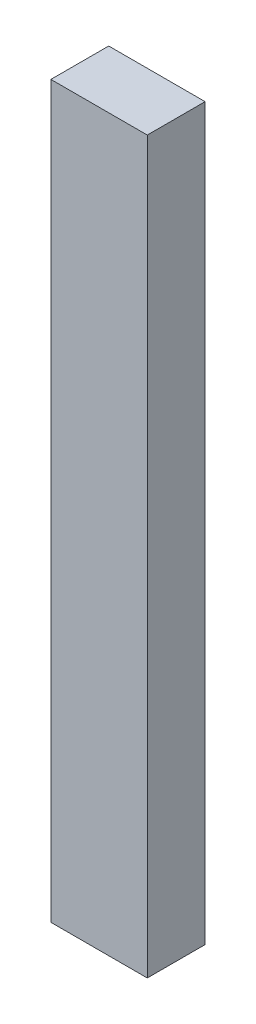
ISO-10303-21;
HEADER;
FILE_DESCRIPTION(('STEP AP214'),'2;1');
FILE_NAME('part.step','',(''),(''),'','','');
FILE_SCHEMA(('AUTOMOTIVE_DESIGN { 1 0 10303 214 1 1 1 1 }'));
ENDSEC;
DATA;
#1=APPLICATION_CONTEXT('core data for automotive mechanical design processes');
#2=APPLICATION_PROTOCOL_DEFINITION('international standard','automotive_design',2000,#1);
#3=PRODUCT_CONTEXT('',#1,'mechanical');
#4=PRODUCT('Part','Part','',(#3));
#5=PRODUCT_RELATED_PRODUCT_CATEGORY('part','',(#4));
#6=PRODUCT_DEFINITION_FORMATION('','',#4);
#7=PRODUCT_DEFINITION_CONTEXT('part definition',#1,'design');
#8=PRODUCT_DEFINITION('design','',#6,#7);
#9=PRODUCT_DEFINITION_SHAPE('','',#8);
#10=(LENGTH_UNIT() NAMED_UNIT(*) SI_UNIT(.MILLI.,.METRE.));
#11=(NAMED_UNIT(*) PLANE_ANGLE_UNIT() SI_UNIT($,.RADIAN.));
#12=(NAMED_UNIT(*) SI_UNIT($,.STERADIAN.) SOLID_ANGLE_UNIT());
#13=UNCERTAINTY_MEASURE_WITH_UNIT(LENGTH_MEASURE(1.E-05),#10,'distance_accuracy_value','');
#14=(GEOMETRIC_REPRESENTATION_CONTEXT(3) GLOBAL_UNCERTAINTY_ASSIGNED_CONTEXT((#13)) GLOBAL_UNIT_ASSIGNED_CONTEXT((#10,
#11,#12)) REPRESENTATION_CONTEXT('',''));
#15=CARTESIAN_POINT('',(0.,0.,0.));
#16=DIRECTION('',(0.,0.,1.));
#17=DIRECTION('',(1.,0.,0.));
#18=AXIS2_PLACEMENT_3D('',#15,#16,#17);
#19=CARTESIAN_POINT('',(0.,480.95,38.1));
#20=DIRECTION('',(1.,0.,0.));
#21=DIRECTION('',(0.,0.,-1.));
#22=AXIS2_PLACEMENT_3D('',#19,#20,#21);
#23=PLANE('',#22);
#24=DIRECTION('',(0.,-1.,0.));
#25=VECTOR('',#24,1.);
#26=CARTESIAN_POINT('',(0.,480.95,0.));
#27=LINE('',#26,#25);
#28=CARTESIAN_POINT('',(0.,480.95,0.));
#29=VERTEX_POINT('',#28);
#30=CARTESIAN_POINT('',(0.,0.,0.));
#31=VERTEX_POINT('',#30);
#32=EDGE_CURVE('E100',#29,#31,#27,.T.);
#33=ORIENTED_EDGE('',*,*,#32,.T.);
#34=DIRECTION('',(0.,0.,-1.));
#35=VECTOR('',#34,1.);
#36=CARTESIAN_POINT('',(0.,0.,38.1));
#37=LINE('',#36,#35);
#38=CARTESIAN_POINT('',(0.,0.,38.1));
#39=VERTEX_POINT('',#38);
#40=EDGE_CURVE('E11',#39,#31,#37,.T.);
#41=ORIENTED_EDGE('',*,*,#40,.F.);
#42=DIRECTION('',(0.,-1.,0.));
#43=VECTOR('',#42,1.);
#44=CARTESIAN_POINT('',(0.,480.95,38.1));
#45=LINE('',#44,#43);
#46=CARTESIAN_POINT('',(0.,480.95,38.1));
#47=VERTEX_POINT('',#46);
#48=EDGE_CURVE('E88',#47,#39,#45,.T.);
#49=ORIENTED_EDGE('',*,*,#48,.F.);
#50=DIRECTION('',(0.,0.,-1.));
#51=VECTOR('',#50,1.);
#52=CARTESIAN_POINT('',(0.,480.95,38.1));
#53=LINE('',#52,#51);
#54=EDGE_CURVE('E96',#47,#29,#53,.T.);
#55=ORIENTED_EDGE('',*,*,#54,.T.);
#56=EDGE_LOOP('',(#33,#41,#49,#55));
#57=FACE_BOUND('',#56,.T.);
#58=ADVANCED_FACE('F37',(#57),#23,.F.);
#59=CARTESIAN_POINT('',(0.,0.,38.1));
#60=DIRECTION('',(0.,1.,0.));
#61=DIRECTION('',(0.,0.,1.));
#62=AXIS2_PLACEMENT_3D('',#59,#60,#61);
#63=PLANE('',#62);
#64=DIRECTION('',(1.,0.,0.));
#65=VECTOR('',#64,1.);
#66=CARTESIAN_POINT('',(0.,0.,0.));
#67=LINE('',#66,#65);
#68=CARTESIAN_POINT('',(63.5000000000001,0.,0.));
#69=VERTEX_POINT('',#68);
#70=EDGE_CURVE('E92',#31,#69,#67,.T.);
#71=ORIENTED_EDGE('',*,*,#70,.T.);
#72=DIRECTION('',(0.,0.,-1.));
#73=VECTOR('',#72,1.);
#74=CARTESIAN_POINT('',(63.5000000000001,0.,38.1));
#75=LINE('',#74,#73);
#76=CARTESIAN_POINT('',(63.5000000000001,0.,38.1));
#77=VERTEX_POINT('',#76);
#78=EDGE_CURVE('E45',#77,#69,#75,.T.);
#79=ORIENTED_EDGE('',*,*,#78,.F.);
#80=DIRECTION('',(1.,0.,0.));
#81=VECTOR('',#80,1.);
#82=CARTESIAN_POINT('',(0.,0.,38.1));
#83=LINE('',#82,#81);
#84=EDGE_CURVE('E83',#39,#77,#83,.T.);
#85=ORIENTED_EDGE('',*,*,#84,.F.);
#86=ORIENTED_EDGE('',*,*,#40,.T.);
#87=EDGE_LOOP('',(#71,#79,#85,#86));
#88=FACE_BOUND('',#87,.T.);
#89=ADVANCED_FACE('F91',(#88),#63,.F.);
#90=CARTESIAN_POINT('',(63.5,480.95,38.1));
#91=DIRECTION('',(-1.,0.,0.));
#92=DIRECTION('',(0.,-1.,0.));
#93=AXIS2_PLACEMENT_3D('',#90,#91,#92);
#94=PLANE('',#93);
#95=DIRECTION('',(0.,1.,0.));
#96=VECTOR('',#95,1.);
#97=CARTESIAN_POINT('',(63.5,480.95,0.));
#98=LINE('',#97,#96);
#99=CARTESIAN_POINT('',(63.5,480.95,0.));
#100=VERTEX_POINT('',#99);
#101=EDGE_CURVE('E70',#69,#100,#98,.T.);
#102=ORIENTED_EDGE('',*,*,#101,.T.);
#103=DIRECTION('',(0.,0.,-1.));
#104=VECTOR('',#103,1.);
#105=CARTESIAN_POINT('',(63.5,480.95,38.1));
#106=LINE('',#105,#104);
#107=CARTESIAN_POINT('',(63.5,480.95,38.1));
#108=VERTEX_POINT('',#107);
#109=EDGE_CURVE('E93',#108,#100,#106,.T.);
#110=ORIENTED_EDGE('',*,*,#109,.F.);
#111=DIRECTION('',(0.,1.,0.));
#112=VECTOR('',#111,1.);
#113=CARTESIAN_POINT('',(63.5,480.95,38.1));
#114=LINE('',#113,#112);
#115=EDGE_CURVE('E86',#77,#108,#114,.T.);
#116=ORIENTED_EDGE('',*,*,#115,.F.);
#117=ORIENTED_EDGE('',*,*,#78,.T.);
#118=EDGE_LOOP('',(#102,#110,#116,#117));
#119=FACE_BOUND('',#118,.T.);
#120=ADVANCED_FACE('F94',(#119),#94,.F.);
#121=CARTESIAN_POINT('',(63.5,480.95,38.1));
#122=DIRECTION('',(0.,-1.,0.));
#123=DIRECTION('',(0.,0.,-1.));
#124=AXIS2_PLACEMENT_3D('',#121,#122,#123);
#125=PLANE('',#124);
#126=DIRECTION('',(-1.,0.,0.));
#127=VECTOR('',#126,1.);
#128=CARTESIAN_POINT('',(63.5,480.95,0.));
#129=LINE('',#128,#127);
#130=EDGE_CURVE('E76',#100,#29,#129,.T.);
#131=ORIENTED_EDGE('',*,*,#130,.T.);
#132=ORIENTED_EDGE('',*,*,#54,.F.);
#133=DIRECTION('',(-1.,0.,0.));
#134=VECTOR('',#133,1.);
#135=CARTESIAN_POINT('',(63.5,480.95,38.1));
#136=LINE('',#135,#134);
#137=EDGE_CURVE('E53',#108,#47,#136,.T.);
#138=ORIENTED_EDGE('',*,*,#137,.F.);
#139=ORIENTED_EDGE('',*,*,#109,.T.);
#140=EDGE_LOOP('',(#131,#132,#138,#139));
#141=FACE_BOUND('',#140,.T.);
#142=ADVANCED_FACE('F107',(#141),#125,.F.);
#143=CARTESIAN_POINT('',(0.,0.,38.1));
#144=DIRECTION('',(0.,0.,1.));
#145=DIRECTION('',(1.,0.,0.));
#146=AXIS2_PLACEMENT_3D('',#143,#144,#145);
#147=PLANE('',#146);
#148=ORIENTED_EDGE('',*,*,#48,.T.);
#149=ORIENTED_EDGE('',*,*,#84,.T.);
#150=ORIENTED_EDGE('',*,*,#115,.T.);
#151=ORIENTED_EDGE('',*,*,#137,.T.);
#152=EDGE_LOOP('',(#148,#149,#150,#151));
#153=FACE_BOUND('',#152,.T.);
#154=ADVANCED_FACE('F84',(#153),#147,.T.);
#155=CARTESIAN_POINT('',(0.,0.,0.));
#156=DIRECTION('',(0.,0.,1.));
#157=DIRECTION('',(1.,0.,0.));
#158=AXIS2_PLACEMENT_3D('',#155,#156,#157);
#159=PLANE('',#158);
#160=ORIENTED_EDGE('',*,*,#32,.F.);
#161=ORIENTED_EDGE('',*,*,#130,.F.);
#162=ORIENTED_EDGE('',*,*,#101,.F.);
#163=ORIENTED_EDGE('',*,*,#70,.F.);
#164=EDGE_LOOP('',(#160,#161,#162,#163));
#165=FACE_BOUND('',#164,.T.);
#166=ADVANCED_FACE('F110',(#165),#159,.F.);
#167=CLOSED_SHELL('',(#58,#89,#120,#142,#154,#166));
#168=MANIFOLD_SOLID_BREP('B2',#167);
#169=ADVANCED_BREP_SHAPE_REPRESENTATION('',(#18,#168),#14);
#170=SHAPE_DEFINITION_REPRESENTATION(#9,#169);
ENDSEC;
END-ISO-10303-21;
